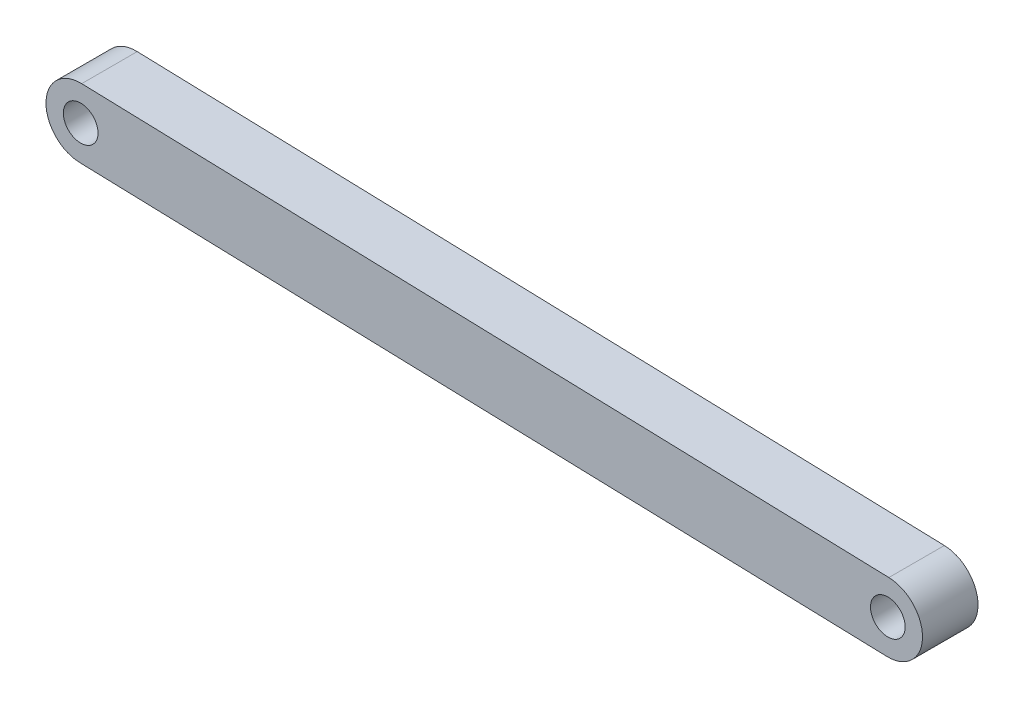
ISO-10303-21;
HEADER;
FILE_DESCRIPTION(('STEP AP214'),'2;1');
FILE_NAME('part.step','',(''),(''),'','','');
FILE_SCHEMA(('AUTOMOTIVE_DESIGN { 1 0 10303 214 1 1 1 1 }'));
ENDSEC;
DATA;
#1=APPLICATION_CONTEXT('core data for automotive mechanical design processes');
#2=APPLICATION_PROTOCOL_DEFINITION('international standard','automotive_design',2000,#1);
#3=PRODUCT_CONTEXT('',#1,'mechanical');
#4=PRODUCT('Part','Part','',(#3));
#5=PRODUCT_RELATED_PRODUCT_CATEGORY('part','',(#4));
#6=PRODUCT_DEFINITION_FORMATION('','',#4);
#7=PRODUCT_DEFINITION_CONTEXT('part definition',#1,'design');
#8=PRODUCT_DEFINITION('design','',#6,#7);
#9=PRODUCT_DEFINITION_SHAPE('','',#8);
#10=(LENGTH_UNIT() NAMED_UNIT(*) SI_UNIT(.MILLI.,.METRE.));
#11=(NAMED_UNIT(*) PLANE_ANGLE_UNIT() SI_UNIT($,.RADIAN.));
#12=(NAMED_UNIT(*) SI_UNIT($,.STERADIAN.) SOLID_ANGLE_UNIT());
#13=UNCERTAINTY_MEASURE_WITH_UNIT(LENGTH_MEASURE(1.E-05),#10,'distance_accuracy_value','');
#14=(GEOMETRIC_REPRESENTATION_CONTEXT(3) GLOBAL_UNCERTAINTY_ASSIGNED_CONTEXT((#13)) GLOBAL_UNIT_ASSIGNED_CONTEXT((#10,
#11,#12)) REPRESENTATION_CONTEXT('',''));
#15=CARTESIAN_POINT('',(0.,0.,0.));
#16=DIRECTION('',(0.,0.,1.));
#17=DIRECTION('',(1.,0.,0.));
#18=AXIS2_PLACEMENT_3D('',#15,#16,#17);
#19=CARTESIAN_POINT('',(116.347959205768,276.519714285714,2.00204749276018));
#20=DIRECTION('',(0.,0.,1.));
#21=DIRECTION('',(1.,0.,0.));
#22=AXIS2_PLACEMENT_3D('',#19,#20,#21);
#23=CYLINDRICAL_SURFACE('',#22,4.99999999999997);
#24=CARTESIAN_POINT('',(116.347959205768,276.519714285714,10.0020474927602));
#25=DIRECTION('',(0.,0.,-1.));
#26=DIRECTION('',(-1.,0.,0.));
#27=AXIS2_PLACEMENT_3D('',#24,#25,#26);
#28=CIRCLE('',#27,4.99999999999997);
#29=CARTESIAN_POINT('',(116.4974560148,281.517478856409,10.0020474927602));
#30=VERTEX_POINT('',#29);
#31=CARTESIAN_POINT('',(116.198462396735,271.52194971502,10.0020474927602));
#32=VERTEX_POINT('',#31);
#33=EDGE_CURVE('E100',#30,#32,#28,.T.);
#34=ORIENTED_EDGE('',*,*,#33,.T.);
#35=DIRECTION('',(0.,0.,1.));
#36=VECTOR('',#35,1.);
#37=CARTESIAN_POINT('',(116.198462396735,271.52194971502,2.00204749276018));
#38=LINE('',#37,#36);
#39=CARTESIAN_POINT('',(116.198462396735,271.52194971502,2.00204749276018));
#40=VERTEX_POINT('',#39);
#41=EDGE_CURVE('E11',#40,#32,#38,.T.);
#42=ORIENTED_EDGE('',*,*,#41,.F.);
#43=CARTESIAN_POINT('',(116.347959205768,276.519714285714,2.00204749276018));
#44=DIRECTION('',(0.,0.,-1.));
#45=DIRECTION('',(-1.,0.,0.));
#46=AXIS2_PLACEMENT_3D('',#43,#44,#45);
#47=CIRCLE('',#46,4.99999999999997);
#48=CARTESIAN_POINT('',(116.4974560148,281.517478856409,2.00204749276018));
#49=VERTEX_POINT('',#48);
#50=EDGE_CURVE('E87',#49,#40,#47,.T.);
#51=ORIENTED_EDGE('',*,*,#50,.F.);
#52=DIRECTION('',(0.,0.,1.));
#53=VECTOR('',#52,1.);
#54=CARTESIAN_POINT('',(116.4974560148,281.517478856409,2.00204749276018));
#55=LINE('',#54,#53);
#56=EDGE_CURVE('E96',#49,#30,#55,.T.);
#57=ORIENTED_EDGE('',*,*,#56,.T.);
#58=EDGE_LOOP('',(#34,#42,#51,#57));
#59=FACE_BOUND('',#58,.T.);
#60=ADVANCED_FACE('F34',(#59),#23,.T.);
#61=CARTESIAN_POINT('',(116.198462396735,271.52194971502,2.00204749276018));
#62=DIRECTION('',(0.0298993618065788,0.999552914138896,0.));
#63=DIRECTION('',(-0.999552914138896,0.0298993618065788,0.));
#64=AXIS2_PLACEMENT_3D('',#61,#62,#63);
#65=PLANE('',#64);
#66=DIRECTION('',(-0.999552914138896,0.0298993618065788,0.));
#67=VECTOR('',#66,1.);
#68=CARTESIAN_POINT('',(116.198462396735,271.52194971502,10.0020474927602));
#69=LINE('',#68,#67);
#70=CARTESIAN_POINT('',(-0.149496809032854,275.002235429306,10.0020474927602));
#71=VERTEX_POINT('',#70);
#72=EDGE_CURVE('E91',#32,#71,#69,.T.);
#73=ORIENTED_EDGE('',*,*,#72,.T.);
#74=DIRECTION('',(0.,0.,1.));
#75=VECTOR('',#74,1.);
#76=CARTESIAN_POINT('',(-0.149496809032854,275.002235429306,2.00204749276018));
#77=LINE('',#76,#75);
#78=CARTESIAN_POINT('',(-0.149496809032854,275.002235429306,2.00204749276018));
#79=VERTEX_POINT('',#78);
#80=EDGE_CURVE('E43',#79,#71,#77,.T.);
#81=ORIENTED_EDGE('',*,*,#80,.F.);
#82=DIRECTION('',(-0.999552914138896,0.0298993618065788,0.));
#83=VECTOR('',#82,1.);
#84=CARTESIAN_POINT('',(116.198462396735,271.52194971502,2.00204749276018));
#85=LINE('',#84,#83);
#86=EDGE_CURVE('E82',#40,#79,#85,.T.);
#87=ORIENTED_EDGE('',*,*,#86,.F.);
#88=ORIENTED_EDGE('',*,*,#41,.T.);
#89=EDGE_LOOP('',(#73,#81,#87,#88));
#90=FACE_BOUND('',#89,.T.);
#91=ADVANCED_FACE('F90',(#90),#65,.F.);
#92=CARTESIAN_POINT('',(0.,280.,2.00204749276018));
#93=DIRECTION('',(0.,0.,1.));
#94=DIRECTION('',(1.,0.,0.));
#95=AXIS2_PLACEMENT_3D('',#92,#93,#94);
#96=CYLINDRICAL_SURFACE('',#95,4.99999999999992);
#97=CARTESIAN_POINT('',(0.,280.,10.0020474927602));
#98=DIRECTION('',(0.,0.,-1.));
#99=DIRECTION('',(-1.,0.,0.));
#100=AXIS2_PLACEMENT_3D('',#97,#98,#99);
#101=CIRCLE('',#100,4.99999999999992);
#102=CARTESIAN_POINT('',(0.149496809032923,284.997764570694,10.0020474927602));
#103=VERTEX_POINT('',#102);
#104=EDGE_CURVE('E69',#71,#103,#101,.T.);
#105=ORIENTED_EDGE('',*,*,#104,.T.);
#106=DIRECTION('',(0.,0.,1.));
#107=VECTOR('',#106,1.);
#108=CARTESIAN_POINT('',(0.149496809032923,284.997764570694,2.00204749276018));
#109=LINE('',#108,#107);
#110=CARTESIAN_POINT('',(0.149496809032923,284.997764570694,2.00204749276018));
#111=VERTEX_POINT('',#110);
#112=EDGE_CURVE('E92',#111,#103,#109,.T.);
#113=ORIENTED_EDGE('',*,*,#112,.F.);
#114=CARTESIAN_POINT('',(0.,280.,2.00204749276018));
#115=DIRECTION('',(0.,0.,-1.));
#116=DIRECTION('',(-1.,0.,0.));
#117=AXIS2_PLACEMENT_3D('',#114,#115,#116);
#118=CIRCLE('',#117,4.99999999999992);
#119=EDGE_CURVE('E85',#79,#111,#118,.T.);
#120=ORIENTED_EDGE('',*,*,#119,.F.);
#121=ORIENTED_EDGE('',*,*,#80,.T.);
#122=EDGE_LOOP('',(#105,#113,#120,#121));
#123=FACE_BOUND('',#122,.T.);
#124=ADVANCED_FACE('F94',(#123),#96,.T.);
#125=CARTESIAN_POINT('',(116.4974560148,281.517478856409,2.00204749276018));
#126=DIRECTION('',(-0.0298993618065778,-0.999552914138896,0.));
#127=DIRECTION('',(0.999552914138896,-0.0298993618065778,0.));
#128=AXIS2_PLACEMENT_3D('',#125,#126,#127);
#129=PLANE('',#128);
#130=DIRECTION('',(0.999552914138896,-0.0298993618065778,0.));
#131=VECTOR('',#130,1.);
#132=CARTESIAN_POINT('',(116.4974560148,281.517478856409,10.0020474927602));
#133=LINE('',#132,#131);
#134=EDGE_CURVE('E75',#103,#30,#133,.T.);
#135=ORIENTED_EDGE('',*,*,#134,.T.);
#136=ORIENTED_EDGE('',*,*,#56,.F.);
#137=DIRECTION('',(0.999552914138896,-0.0298993618065778,0.));
#138=VECTOR('',#137,1.);
#139=CARTESIAN_POINT('',(116.4974560148,281.517478856409,2.00204749276018));
#140=LINE('',#139,#138);
#141=EDGE_CURVE('E52',#111,#49,#140,.T.);
#142=ORIENTED_EDGE('',*,*,#141,.F.);
#143=ORIENTED_EDGE('',*,*,#112,.T.);
#144=EDGE_LOOP('',(#135,#136,#142,#143));
#145=FACE_BOUND('',#144,.T.);
#146=ADVANCED_FACE('F128',(#145),#129,.F.);
#147=CARTESIAN_POINT('',(116.347959205768,276.519714285714,2.00204749276018));
#148=DIRECTION('',(0.,0.,-1.));
#149=DIRECTION('',(-1.,0.,0.));
#150=AXIS2_PLACEMENT_3D('',#147,#148,#149);
#151=PLANE('',#150);
#152=CARTESIAN_POINT('',(0.,280.,2.00204749276018));
#153=DIRECTION('',(0.,0.,-1.));
#154=DIRECTION('',(-1.,0.,0.));
#155=AXIS2_PLACEMENT_3D('',#152,#153,#154);
#156=CIRCLE('',#155,2.5);
#157=CARTESIAN_POINT('',(-2.5,280.,2.00204749276018));
#158=VERTEX_POINT('',#157);
#159=EDGE_CURVE('E103',#158,#158,#156,.T.);
#160=ORIENTED_EDGE('',*,*,#159,.F.);
#161=EDGE_LOOP('',(#160));
#162=FACE_BOUND('',#161,.T.);
#163=CARTESIAN_POINT('',(116.347959205768,276.519714285714,2.00204749276018));
#164=DIRECTION('',(0.,0.,-1.));
#165=DIRECTION('',(-1.,0.,0.));
#166=AXIS2_PLACEMENT_3D('',#163,#164,#165);
#167=CIRCLE('',#166,2.5);
#168=CARTESIAN_POINT('',(113.847959205768,276.519714285714,2.00204749276018));
#169=VERTEX_POINT('',#168);
#170=EDGE_CURVE('E110',#169,#169,#167,.T.);
#171=ORIENTED_EDGE('',*,*,#170,.F.);
#172=EDGE_LOOP('',(#171));
#173=FACE_BOUND('',#172,.T.);
#174=ORIENTED_EDGE('',*,*,#50,.T.);
#175=ORIENTED_EDGE('',*,*,#86,.T.);
#176=ORIENTED_EDGE('',*,*,#119,.T.);
#177=ORIENTED_EDGE('',*,*,#141,.T.);
#178=EDGE_LOOP('',(#174,#175,#176,#177));
#179=FACE_BOUND('',#178,.T.);
#180=ADVANCED_FACE('F83',(#162,#173,#179),#151,.T.);
#181=CARTESIAN_POINT('',(116.347959205768,276.519714285714,10.0020474927602));
#182=DIRECTION('',(0.,0.,-1.));
#183=DIRECTION('',(-1.,0.,0.));
#184=AXIS2_PLACEMENT_3D('',#181,#182,#183);
#185=PLANE('',#184);
#186=CARTESIAN_POINT('',(0.,280.,10.0020474927602));
#187=DIRECTION('',(0.,0.,-1.));
#188=DIRECTION('',(-1.,0.,0.));
#189=AXIS2_PLACEMENT_3D('',#186,#187,#188);
#190=CIRCLE('',#189,2.5);
#191=CARTESIAN_POINT('',(-2.5,280.,10.0020474927602));
#192=VERTEX_POINT('',#191);
#193=EDGE_CURVE('E37',#192,#192,#190,.T.);
#194=ORIENTED_EDGE('',*,*,#193,.T.);
#195=EDGE_LOOP('',(#194));
#196=FACE_BOUND('',#195,.T.);
#197=CARTESIAN_POINT('',(116.347959205768,276.519714285714,10.0020474927602));
#198=DIRECTION('',(0.,0.,-1.));
#199=DIRECTION('',(-1.,0.,0.));
#200=AXIS2_PLACEMENT_3D('',#197,#198,#199);
#201=CIRCLE('',#200,2.5);
#202=CARTESIAN_POINT('',(113.847959205768,276.519714285714,10.0020474927602));
#203=VERTEX_POINT('',#202);
#204=EDGE_CURVE('E108',#203,#203,#201,.T.);
#205=ORIENTED_EDGE('',*,*,#204,.T.);
#206=EDGE_LOOP('',(#205));
#207=FACE_BOUND('',#206,.T.);
#208=ORIENTED_EDGE('',*,*,#33,.F.);
#209=ORIENTED_EDGE('',*,*,#134,.F.);
#210=ORIENTED_EDGE('',*,*,#104,.F.);
#211=ORIENTED_EDGE('',*,*,#72,.F.);
#212=EDGE_LOOP('',(#208,#209,#210,#211));
#213=FACE_BOUND('',#212,.T.);
#214=ADVANCED_FACE('F127',(#196,#207,#213),#185,.F.);
#215=CARTESIAN_POINT('',(116.347959205768,276.519714285714,-9.99795250723982));
#216=DIRECTION('',(0.,0.,1.));
#217=DIRECTION('',(1.,0.,0.));
#218=AXIS2_PLACEMENT_3D('',#215,#216,#217);
#219=CYLINDRICAL_SURFACE('',#218,2.5);
#220=ORIENTED_EDGE('',*,*,#170,.T.);
#221=EDGE_LOOP('',(#220));
#222=FACE_BOUND('',#221,.T.);
#223=ORIENTED_EDGE('',*,*,#204,.F.);
#224=EDGE_LOOP('',(#223));
#225=FACE_BOUND('',#224,.T.);
#226=ADVANCED_FACE('F134',(#222,#225),#219,.F.);
#227=CARTESIAN_POINT('',(0.,280.,-9.99795250723982));
#228=DIRECTION('',(0.,0.,1.));
#229=DIRECTION('',(1.,0.,0.));
#230=AXIS2_PLACEMENT_3D('',#227,#228,#229);
#231=CYLINDRICAL_SURFACE('',#230,2.5);
#232=ORIENTED_EDGE('',*,*,#159,.T.);
#233=EDGE_LOOP('',(#232));
#234=FACE_BOUND('',#233,.T.);
#235=ORIENTED_EDGE('',*,*,#193,.F.);
#236=EDGE_LOOP('',(#235));
#237=FACE_BOUND('',#236,.T.);
#238=ADVANCED_FACE('F122',(#234,#237),#231,.F.);
#239=CLOSED_SHELL('',(#60,#91,#124,#146,#180,#214,#226,#238));
#240=MANIFOLD_SOLID_BREP('B2',#239);
#241=ADVANCED_BREP_SHAPE_REPRESENTATION('',(#18,#240),#14);
#242=SHAPE_DEFINITION_REPRESENTATION(#9,#241);
ENDSEC;
END-ISO-10303-21;
